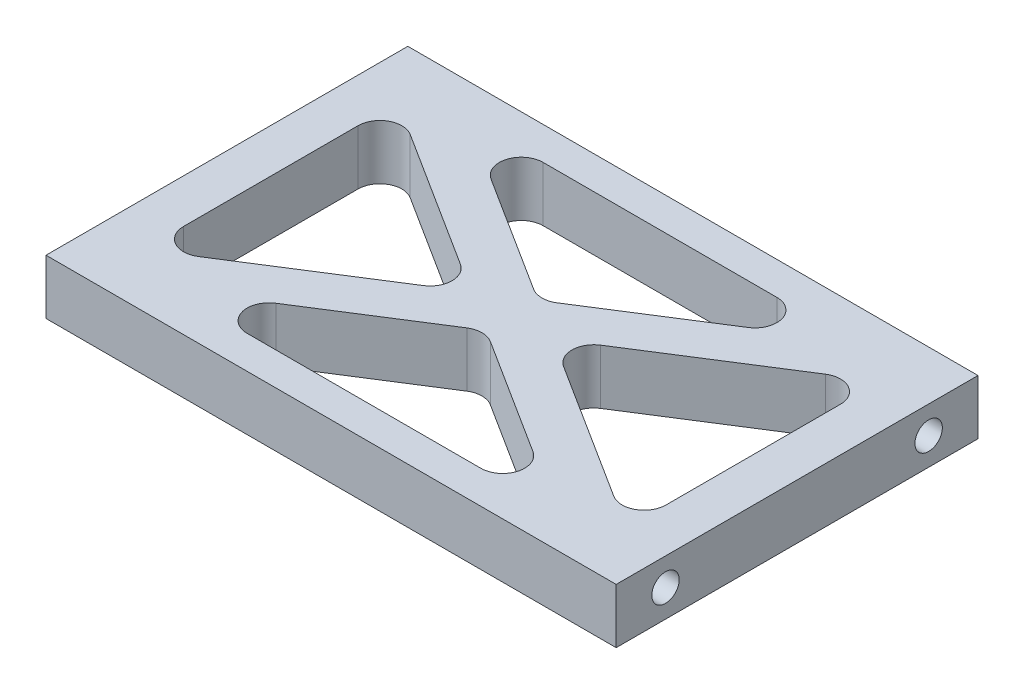
ISO-10303-21;
HEADER;
FILE_DESCRIPTION(('STEP AP214'),'2;1');
FILE_NAME('part.step','',(''),(''),'','','');
FILE_SCHEMA(('AUTOMOTIVE_DESIGN { 1 0 10303 214 1 1 1 1 }'));
ENDSEC;
DATA;
#1=APPLICATION_CONTEXT('core data for automotive mechanical design processes');
#2=APPLICATION_PROTOCOL_DEFINITION('international standard','automotive_design',2000,#1);
#3=PRODUCT_CONTEXT('',#1,'mechanical');
#4=PRODUCT('Part','Part','',(#3));
#5=PRODUCT_RELATED_PRODUCT_CATEGORY('part','',(#4));
#6=PRODUCT_DEFINITION_FORMATION('','',#4);
#7=PRODUCT_DEFINITION_CONTEXT('part definition',#1,'design');
#8=PRODUCT_DEFINITION('design','',#6,#7);
#9=PRODUCT_DEFINITION_SHAPE('','',#8);
#10=(LENGTH_UNIT() NAMED_UNIT(*) SI_UNIT(.MILLI.,.METRE.));
#11=(NAMED_UNIT(*) PLANE_ANGLE_UNIT() SI_UNIT($,.RADIAN.));
#12=(NAMED_UNIT(*) SI_UNIT($,.STERADIAN.) SOLID_ANGLE_UNIT());
#13=UNCERTAINTY_MEASURE_WITH_UNIT(LENGTH_MEASURE(1.E-05),#10,'distance_accuracy_value','');
#14=(GEOMETRIC_REPRESENTATION_CONTEXT(3) GLOBAL_UNCERTAINTY_ASSIGNED_CONTEXT((#13)) GLOBAL_UNIT_ASSIGNED_CONTEXT((#10,
#11,#12)) REPRESENTATION_CONTEXT('',''));
#15=CARTESIAN_POINT('',(0.,0.,0.));
#16=DIRECTION('',(0.,0.,1.));
#17=DIRECTION('',(1.,0.,0.));
#18=AXIS2_PLACEMENT_3D('',#15,#16,#17);
#19=CARTESIAN_POINT('',(0.,5.,0.));
#20=DIRECTION('',(0.,-1.,0.));
#21=DIRECTION('',(0.,0.,-1.));
#22=AXIS2_PLACEMENT_3D('',#19,#20,#21);
#23=PLANE('',#22);
#24=DIRECTION('',(0.,0.,-1.));
#25=VECTOR('',#24,1.);
#26=CARTESIAN_POINT('',(48.,5.,-28.0927947553596));
#27=LINE('',#26,#25);
#28=CARTESIAN_POINT('',(48.,5.,-8.54517972005013));
#29=VERTEX_POINT('',#28);
#30=CARTESIAN_POINT('',(48.,5.,-24.4548202799499));
#31=VERTEX_POINT('',#30);
#32=EDGE_CURVE('E565',#29,#31,#27,.T.);
#33=ORIENTED_EDGE('',*,*,#32,.F.);
#34=CARTESIAN_POINT('',(46.,5.,-8.54517972005013));
#35=DIRECTION('',(0.,-1.,0.));
#36=DIRECTION('',(0.,0.,-1.));
#37=AXIS2_PLACEMENT_3D('',#34,#35,#36);
#38=CIRCLE('',#37,2.);
#39=CARTESIAN_POINT('',(44.928351120537,5.,-6.85652087968426));
#40=VERTEX_POINT('',#39);
#41=EDGE_CURVE('E309',#29,#40,#38,.T.);
#42=ORIENTED_EDGE('',*,*,#41,.T.);
#43=DIRECTION('',(0.844329420182934,0.,0.535824439731477));
#44=VECTOR('',#43,1.);
#45=CARTESIAN_POINT('',(48.,5.,-4.90720524464046));
#46=LINE('',#45,#44);
#47=CARTESIAN_POINT('',(32.393482800616,5.,-14.8113411596341));
#48=VERTEX_POINT('',#47);
#49=EDGE_CURVE('E383',#48,#40,#46,.T.);
#50=ORIENTED_EDGE('',*,*,#49,.F.);
#51=CARTESIAN_POINT('',(33.4651316800789,5.,-16.5));
#52=DIRECTION('',(0.,-1.,0.));
#53=DIRECTION('',(0.,0.,-1.));
#54=AXIS2_PLACEMENT_3D('',#51,#52,#53);
#55=CIRCLE('',#54,2.);
#56=CARTESIAN_POINT('',(32.393482800616,5.,-18.1886588403659));
#57=VERTEX_POINT('',#56);
#58=EDGE_CURVE('E333',#48,#57,#55,.T.);
#59=ORIENTED_EDGE('',*,*,#58,.T.);
#60=DIRECTION('',(-0.844329420182933,0.,0.535824439731478));
#61=VECTOR('',#60,1.);
#62=CARTESIAN_POINT('',(29.7325658400395,5.,-16.5));
#63=LINE('',#62,#61);
#64=CARTESIAN_POINT('',(44.928351120537,5.,-26.1434791203158));
#65=VERTEX_POINT('',#64);
#66=EDGE_CURVE('E568',#65,#57,#63,.T.);
#67=ORIENTED_EDGE('',*,*,#66,.F.);
#68=CARTESIAN_POINT('',(46.,5.,-24.4548202799499));
#69=DIRECTION('',(0.,-1.,0.));
#70=DIRECTION('',(0.,0.,-1.));
#71=AXIS2_PLACEMENT_3D('',#68,#69,#70);
#72=CIRCLE('',#71,2.);
#73=EDGE_CURVE('E313',#65,#31,#72,.T.);
#74=ORIENTED_EDGE('',*,*,#73,.T.);
#75=EDGE_LOOP('',(#33,#42,#50,#59,#67,#74));
#76=FACE_BOUND('',#75,.T.);
#77=DIRECTION('',(-0.844329420182933,0.,-0.535824439731477));
#78=VECTOR('',#77,1.);
#79=CARTESIAN_POINT('',(22.2674341599605,5.,-16.5));
#80=LINE('',#79,#78);
#81=CARTESIAN_POINT('',(19.606517199384,5.,-18.1886588403659));
#82=VERTEX_POINT('',#81);
#83=CARTESIAN_POINT('',(7.07164887946296,5.,-26.1434791203158));
#84=VERTEX_POINT('',#83);
#85=EDGE_CURVE('E385',#82,#84,#80,.T.);
#86=ORIENTED_EDGE('',*,*,#85,.F.);
#87=CARTESIAN_POINT('',(18.534868319921,5.,-16.5));
#88=DIRECTION('',(0.,-1.,0.));
#89=DIRECTION('',(0.,0.,-1.));
#90=AXIS2_PLACEMENT_3D('',#87,#88,#89);
#91=CIRCLE('',#90,2.);
#92=CARTESIAN_POINT('',(19.606517199384,5.,-14.8113411596341));
#93=VERTEX_POINT('',#92);
#94=EDGE_CURVE('E337',#82,#93,#91,.T.);
#95=ORIENTED_EDGE('',*,*,#94,.T.);
#96=DIRECTION('',(0.844329420182933,0.,-0.535824439731477));
#97=VECTOR('',#96,1.);
#98=CARTESIAN_POINT('',(4.,5.,-4.90720524464044));
#99=LINE('',#98,#97);
#100=CARTESIAN_POINT('',(7.07164887946296,5.,-6.85652087968424));
#101=VERTEX_POINT('',#100);
#102=EDGE_CURVE('E392',#101,#93,#99,.T.);
#103=ORIENTED_EDGE('',*,*,#102,.F.);
#104=CARTESIAN_POINT('',(6.,5.,-8.54517972005011));
#105=DIRECTION('',(0.,-1.,0.));
#106=DIRECTION('',(0.,0.,-1.));
#107=AXIS2_PLACEMENT_3D('',#104,#105,#106);
#108=CIRCLE('',#107,2.);
#109=CARTESIAN_POINT('',(4.,5.,-8.54517972005011));
#110=VERTEX_POINT('',#109);
#111=EDGE_CURVE('E329',#101,#110,#108,.T.);
#112=ORIENTED_EDGE('',*,*,#111,.T.);
#113=DIRECTION('',(0.,0.,1.));
#114=VECTOR('',#113,1.);
#115=CARTESIAN_POINT('',(4.,5.,-28.0927947553596));
#116=LINE('',#115,#114);
#117=CARTESIAN_POINT('',(4.,5.,-24.4548202799499));
#118=VERTEX_POINT('',#117);
#119=EDGE_CURVE('E388',#118,#110,#116,.T.);
#120=ORIENTED_EDGE('',*,*,#119,.F.);
#121=CARTESIAN_POINT('',(6.,5.,-24.4548202799499));
#122=DIRECTION('',(0.,-1.,0.));
#123=DIRECTION('',(0.,0.,-1.));
#124=AXIS2_PLACEMENT_3D('',#121,#122,#123);
#125=CIRCLE('',#124,2.);
#126=EDGE_CURVE('E325',#118,#84,#125,.T.);
#127=ORIENTED_EDGE('',*,*,#126,.T.);
#128=EDGE_LOOP('',(#86,#95,#103,#112,#120,#127));
#129=FACE_BOUND('',#128,.T.);
#130=DIRECTION('',(0.,0.,1.));
#131=VECTOR('',#130,1.);
#132=CARTESIAN_POINT('',(0.,5.,0.));
#133=LINE('',#132,#131);
#134=CARTESIAN_POINT('',(0.,5.,-33.));
#135=VERTEX_POINT('',#134);
#136=CARTESIAN_POINT('',(0.,5.,0.));
#137=VERTEX_POINT('',#136);
#138=EDGE_CURVE('E230',#135,#137,#133,.T.);
#139=ORIENTED_EDGE('',*,*,#138,.T.);
#140=DIRECTION('',(1.,0.,0.));
#141=VECTOR('',#140,1.);
#142=CARTESIAN_POINT('',(0.,5.,0.));
#143=LINE('',#142,#141);
#144=CARTESIAN_POINT('',(52.,5.,0.));
#145=VERTEX_POINT('',#144);
#146=EDGE_CURVE('E219',#137,#145,#143,.T.);
#147=ORIENTED_EDGE('',*,*,#146,.T.);
#148=DIRECTION('',(0.,0.,-1.));
#149=VECTOR('',#148,1.);
#150=CARTESIAN_POINT('',(52.,5.,0.));
#151=LINE('',#150,#149);
#152=CARTESIAN_POINT('',(52.,5.,-33.));
#153=VERTEX_POINT('',#152);
#154=EDGE_CURVE('E229',#145,#153,#151,.T.);
#155=ORIENTED_EDGE('',*,*,#154,.T.);
#156=DIRECTION('',(-1.,0.,0.));
#157=VECTOR('',#156,1.);
#158=CARTESIAN_POINT('',(0.,5.,-33.));
#159=LINE('',#158,#157);
#160=EDGE_CURVE('E234',#153,#135,#159,.T.);
#161=ORIENTED_EDGE('',*,*,#160,.T.);
#162=EDGE_LOOP('',(#139,#147,#155,#161));
#163=FACE_BOUND('',#162,.T.);
#164=DIRECTION('',(-0.844329420182933,0.,-0.535824439731477));
#165=VECTOR('',#164,1.);
#166=CARTESIAN_POINT('',(43.5401614326878,5.,-3.));
#167=LINE('',#166,#165);
#168=CARTESIAN_POINT('',(37.7277293205961,5.,-6.68865884036587));
#169=VERTEX_POINT('',#168);
#170=CARTESIAN_POINT('',(27.0716488794629,5.,-13.4511714280081));
#171=VERTEX_POINT('',#170);
#172=EDGE_CURVE('E361',#169,#171,#167,.T.);
#173=ORIENTED_EDGE('',*,*,#172,.F.);
#174=CARTESIAN_POINT('',(36.6560804411331,5.,-5.));
#175=DIRECTION('',(0.,-1.,0.));
#176=DIRECTION('',(0.,0.,-1.));
#177=AXIS2_PLACEMENT_3D('',#174,#175,#176);
#178=CIRCLE('',#177,2.);
#179=CARTESIAN_POINT('',(36.6560804411331,5.,-3.));
#180=VERTEX_POINT('',#179);
#181=EDGE_CURVE('E48',#169,#180,#178,.T.);
#182=ORIENTED_EDGE('',*,*,#181,.T.);
#183=DIRECTION('',(1.,0.,0.));
#184=VECTOR('',#183,1.);
#185=CARTESIAN_POINT('',(8.45983856731221,5.,-3.));
#186=LINE('',#185,#184);
#187=CARTESIAN_POINT('',(15.3439195588668,5.,-3.));
#188=VERTEX_POINT('',#187);
#189=EDGE_CURVE('E369',#188,#180,#186,.T.);
#190=ORIENTED_EDGE('',*,*,#189,.F.);
#191=CARTESIAN_POINT('',(15.3439195588668,5.,-5.));
#192=DIRECTION('',(0.,-1.,0.));
#193=DIRECTION('',(0.,0.,-1.));
#194=AXIS2_PLACEMENT_3D('',#191,#192,#193);
#195=CIRCLE('',#194,2.);
#196=CARTESIAN_POINT('',(14.2722706794039,5.,-6.68865884036587));
#197=VERTEX_POINT('',#196);
#198=EDGE_CURVE('E11',#188,#197,#195,.T.);
#199=ORIENTED_EDGE('',*,*,#198,.T.);
#200=DIRECTION('',(-0.844329420182934,0.,0.535824439731477));
#201=VECTOR('',#200,1.);
#202=CARTESIAN_POINT('',(26.,5.,-14.1312562938211));
#203=LINE('',#202,#201);
#204=CARTESIAN_POINT('',(24.928351120537,5.,-13.4511714280081));
#205=VERTEX_POINT('',#204);
#206=EDGE_CURVE('E367',#205,#197,#203,.T.);
#207=ORIENTED_EDGE('',*,*,#206,.F.);
#208=CARTESIAN_POINT('',(26.,5.,-11.7625125876422));
#209=DIRECTION('',(0.,-1.,0.));
#210=DIRECTION('',(0.,0.,-1.));
#211=AXIS2_PLACEMENT_3D('',#208,#209,#210);
#212=CIRCLE('',#211,2.);
#213=EDGE_CURVE('E345',#205,#171,#212,.T.);
#214=ORIENTED_EDGE('',*,*,#213,.T.);
#215=EDGE_LOOP('',(#173,#182,#190,#199,#207,#214));
#216=FACE_BOUND('',#215,.T.);
#217=DIRECTION('',(0.844329420182934,0.,0.535824439731477));
#218=VECTOR('',#217,1.);
#219=CARTESIAN_POINT('',(26.,5.,-18.8687437061789));
#220=LINE('',#219,#218);
#221=CARTESIAN_POINT('',(14.2722706794039,5.,-26.3113411596341));
#222=VERTEX_POINT('',#221);
#223=CARTESIAN_POINT('',(24.928351120537,5.,-19.5488285719919));
#224=VERTEX_POINT('',#223);
#225=EDGE_CURVE('E547',#222,#224,#220,.T.);
#226=ORIENTED_EDGE('',*,*,#225,.F.);
#227=CARTESIAN_POINT('',(15.3439195588668,5.,-28.));
#228=DIRECTION('',(0.,-1.,0.));
#229=DIRECTION('',(0.,0.,-1.));
#230=AXIS2_PLACEMENT_3D('',#227,#228,#229);
#231=CIRCLE('',#230,2.);
#232=CARTESIAN_POINT('',(15.3439195588668,5.,-30.));
#233=VERTEX_POINT('',#232);
#234=EDGE_CURVE('E321',#222,#233,#231,.T.);
#235=ORIENTED_EDGE('',*,*,#234,.T.);
#236=DIRECTION('',(-1.,0.,0.));
#237=VECTOR('',#236,1.);
#238=CARTESIAN_POINT('',(8.45983856731221,5.,-30.));
#239=LINE('',#238,#237);
#240=CARTESIAN_POINT('',(36.6560804411331,5.,-30.));
#241=VERTEX_POINT('',#240);
#242=EDGE_CURVE('E554',#241,#233,#239,.T.);
#243=ORIENTED_EDGE('',*,*,#242,.F.);
#244=CARTESIAN_POINT('',(36.6560804411331,5.,-28.));
#245=DIRECTION('',(0.,-1.,0.));
#246=DIRECTION('',(0.,0.,-1.));
#247=AXIS2_PLACEMENT_3D('',#244,#245,#246);
#248=CIRCLE('',#247,2.);
#249=CARTESIAN_POINT('',(37.7277293205961,5.,-26.3113411596341));
#250=VERTEX_POINT('',#249);
#251=EDGE_CURVE('E317',#241,#250,#248,.T.);
#252=ORIENTED_EDGE('',*,*,#251,.T.);
#253=DIRECTION('',(0.844329420182934,0.,-0.535824439731477));
#254=VECTOR('',#253,1.);
#255=CARTESIAN_POINT('',(43.5401614326878,5.,-30.));
#256=LINE('',#255,#254);
#257=CARTESIAN_POINT('',(27.0716488794629,5.,-19.5488285719919));
#258=VERTEX_POINT('',#257);
#259=EDGE_CURVE('E550',#258,#250,#256,.T.);
#260=ORIENTED_EDGE('',*,*,#259,.F.);
#261=CARTESIAN_POINT('',(26.,5.,-21.2374874123578));
#262=DIRECTION('',(0.,-1.,0.));
#263=DIRECTION('',(0.,0.,-1.));
#264=AXIS2_PLACEMENT_3D('',#261,#262,#263);
#265=CIRCLE('',#264,2.);
#266=EDGE_CURVE('E341',#258,#224,#265,.T.);
#267=ORIENTED_EDGE('',*,*,#266,.T.);
#268=EDGE_LOOP('',(#226,#235,#243,#252,#260,#267));
#269=FACE_BOUND('',#268,.T.);
#270=ADVANCED_FACE('F33',(#76,#129,#163,#216,#269),#23,.F.);
#271=CARTESIAN_POINT('',(0.,0.,0.));
#272=DIRECTION('',(0.,-1.,0.));
#273=DIRECTION('',(0.,0.,-1.));
#274=AXIS2_PLACEMENT_3D('',#271,#272,#273);
#275=PLANE('',#274);
#276=DIRECTION('',(0.,0.,1.));
#277=VECTOR('',#276,1.);
#278=CARTESIAN_POINT('',(0.,0.,0.));
#279=LINE('',#278,#277);
#280=CARTESIAN_POINT('',(0.,0.,-33.));
#281=VERTEX_POINT('',#280);
#282=CARTESIAN_POINT('',(0.,0.,0.));
#283=VERTEX_POINT('',#282);
#284=EDGE_CURVE('E242',#281,#283,#279,.T.);
#285=ORIENTED_EDGE('',*,*,#284,.F.);
#286=DIRECTION('',(-1.,0.,0.));
#287=VECTOR('',#286,1.);
#288=CARTESIAN_POINT('',(0.,0.,-33.));
#289=LINE('',#288,#287);
#290=CARTESIAN_POINT('',(52.,0.,-33.));
#291=VERTEX_POINT('',#290);
#292=EDGE_CURVE('E238',#291,#281,#289,.T.);
#293=ORIENTED_EDGE('',*,*,#292,.F.);
#294=DIRECTION('',(0.,0.,-1.));
#295=VECTOR('',#294,1.);
#296=CARTESIAN_POINT('',(52.,0.,0.));
#297=LINE('',#296,#295);
#298=CARTESIAN_POINT('',(52.,0.,0.));
#299=VERTEX_POINT('',#298);
#300=EDGE_CURVE('E408',#299,#291,#297,.T.);
#301=ORIENTED_EDGE('',*,*,#300,.F.);
#302=DIRECTION('',(1.,0.,0.));
#303=VECTOR('',#302,1.);
#304=CARTESIAN_POINT('',(0.,0.,0.));
#305=LINE('',#304,#303);
#306=EDGE_CURVE('E406',#283,#299,#305,.T.);
#307=ORIENTED_EDGE('',*,*,#306,.F.);
#308=EDGE_LOOP('',(#285,#293,#301,#307));
#309=FACE_BOUND('',#308,.T.);
#310=DIRECTION('',(0.,0.,1.));
#311=VECTOR('',#310,1.);
#312=CARTESIAN_POINT('',(4.,0.,-28.0927947553596));
#313=LINE('',#312,#311);
#314=CARTESIAN_POINT('',(4.,0.,-24.4548202799499));
#315=VERTEX_POINT('',#314);
#316=CARTESIAN_POINT('',(4.,0.,-8.54517972005011));
#317=VERTEX_POINT('',#316);
#318=EDGE_CURVE('E397',#315,#317,#313,.T.);
#319=ORIENTED_EDGE('',*,*,#318,.T.);
#320=CARTESIAN_POINT('',(6.,0.,-8.54517972005011));
#321=DIRECTION('',(0.,-1.,0.));
#322=DIRECTION('',(0.,0.,-1.));
#323=AXIS2_PLACEMENT_3D('',#320,#321,#322);
#324=CIRCLE('',#323,2.);
#325=CARTESIAN_POINT('',(7.07164887946296,0.,-6.85652087968424));
#326=VERTEX_POINT('',#325);
#327=EDGE_CURVE('E327',#317,#326,#324,.F.);
#328=ORIENTED_EDGE('',*,*,#327,.T.);
#329=DIRECTION('',(0.844329420182933,0.,-0.535824439731477));
#330=VECTOR('',#329,1.);
#331=CARTESIAN_POINT('',(4.,0.,-4.90720524464044));
#332=LINE('',#331,#330);
#333=CARTESIAN_POINT('',(19.606517199384,0.,-14.8113411596341));
#334=VERTEX_POINT('',#333);
#335=EDGE_CURVE('E389',#326,#334,#332,.T.);
#336=ORIENTED_EDGE('',*,*,#335,.T.);
#337=CARTESIAN_POINT('',(18.534868319921,0.,-16.5));
#338=DIRECTION('',(0.,-1.,0.));
#339=DIRECTION('',(0.,0.,-1.));
#340=AXIS2_PLACEMENT_3D('',#337,#338,#339);
#341=CIRCLE('',#340,2.);
#342=CARTESIAN_POINT('',(19.606517199384,0.,-18.1886588403659));
#343=VERTEX_POINT('',#342);
#344=EDGE_CURVE('E335',#334,#343,#341,.F.);
#345=ORIENTED_EDGE('',*,*,#344,.T.);
#346=DIRECTION('',(-0.844329420182933,0.,-0.535824439731477));
#347=VECTOR('',#346,1.);
#348=CARTESIAN_POINT('',(22.2674341599605,0.,-16.5));
#349=LINE('',#348,#347);
#350=CARTESIAN_POINT('',(7.07164887946296,0.,-26.1434791203158));
#351=VERTEX_POINT('',#350);
#352=EDGE_CURVE('E374',#343,#351,#349,.T.);
#353=ORIENTED_EDGE('',*,*,#352,.T.);
#354=CARTESIAN_POINT('',(6.,0.,-24.4548202799499));
#355=DIRECTION('',(0.,-1.,0.));
#356=DIRECTION('',(0.,0.,-1.));
#357=AXIS2_PLACEMENT_3D('',#354,#355,#356);
#358=CIRCLE('',#357,2.);
#359=EDGE_CURVE('E323',#351,#315,#358,.F.);
#360=ORIENTED_EDGE('',*,*,#359,.T.);
#361=EDGE_LOOP('',(#319,#328,#336,#345,#353,#360));
#362=FACE_BOUND('',#361,.T.);
#363=DIRECTION('',(-0.844329420182934,0.,0.535824439731477));
#364=VECTOR('',#363,1.);
#365=CARTESIAN_POINT('',(26.,0.,-14.1312562938211));
#366=LINE('',#365,#364);
#367=CARTESIAN_POINT('',(24.928351120537,0.,-13.4511714280081));
#368=VERTEX_POINT('',#367);
#369=CARTESIAN_POINT('',(14.2722706794039,0.,-6.68865884036587));
#370=VERTEX_POINT('',#369);
#371=EDGE_CURVE('E356',#368,#370,#366,.T.);
#372=ORIENTED_EDGE('',*,*,#371,.T.);
#373=CARTESIAN_POINT('',(15.3439195588668,0.,-5.));
#374=DIRECTION('',(0.,-1.,0.));
#375=DIRECTION('',(0.,0.,-1.));
#376=AXIS2_PLACEMENT_3D('',#373,#374,#375);
#377=CIRCLE('',#376,2.);
#378=CARTESIAN_POINT('',(15.3439195588668,0.,-3.));
#379=VERTEX_POINT('',#378);
#380=EDGE_CURVE('E41',#370,#379,#377,.F.);
#381=ORIENTED_EDGE('',*,*,#380,.T.);
#382=DIRECTION('',(1.,0.,0.));
#383=VECTOR('',#382,1.);
#384=CARTESIAN_POINT('',(8.45983856731221,0.,-3.));
#385=LINE('',#384,#383);
#386=CARTESIAN_POINT('',(36.6560804411331,0.,-3.));
#387=VERTEX_POINT('',#386);
#388=EDGE_CURVE('E354',#379,#387,#385,.T.);
#389=ORIENTED_EDGE('',*,*,#388,.T.);
#390=CARTESIAN_POINT('',(36.6560804411331,0.,-5.));
#391=DIRECTION('',(0.,-1.,0.));
#392=DIRECTION('',(0.,0.,-1.));
#393=AXIS2_PLACEMENT_3D('',#390,#391,#392);
#394=CIRCLE('',#393,2.);
#395=CARTESIAN_POINT('',(37.7277293205961,0.,-6.68865884036587));
#396=VERTEX_POINT('',#395);
#397=EDGE_CURVE('E347',#387,#396,#394,.F.);
#398=ORIENTED_EDGE('',*,*,#397,.T.);
#399=DIRECTION('',(-0.844329420182933,0.,-0.535824439731477));
#400=VECTOR('',#399,1.);
#401=CARTESIAN_POINT('',(43.5401614326878,0.,-3.));
#402=LINE('',#401,#400);
#403=CARTESIAN_POINT('',(27.0716488794629,0.,-13.4511714280081));
#404=VERTEX_POINT('',#403);
#405=EDGE_CURVE('E380',#396,#404,#402,.T.);
#406=ORIENTED_EDGE('',*,*,#405,.T.);
#407=CARTESIAN_POINT('',(26.,0.,-11.7625125876422));
#408=DIRECTION('',(0.,-1.,0.));
#409=DIRECTION('',(0.,0.,-1.));
#410=AXIS2_PLACEMENT_3D('',#407,#408,#409);
#411=CIRCLE('',#410,2.);
#412=EDGE_CURVE('E343',#404,#368,#411,.F.);
#413=ORIENTED_EDGE('',*,*,#412,.T.);
#414=EDGE_LOOP('',(#372,#381,#389,#398,#406,#413));
#415=FACE_BOUND('',#414,.T.);
#416=DIRECTION('',(-0.844329420182933,0.,0.535824439731478));
#417=VECTOR('',#416,1.);
#418=CARTESIAN_POINT('',(29.7325658400395,0.,-16.5));
#419=LINE('',#418,#417);
#420=CARTESIAN_POINT('',(44.928351120537,0.,-26.1434791203158));
#421=VERTEX_POINT('',#420);
#422=CARTESIAN_POINT('',(32.393482800616,0.,-18.1886588403659));
#423=VERTEX_POINT('',#422);
#424=EDGE_CURVE('E576',#421,#423,#419,.T.);
#425=ORIENTED_EDGE('',*,*,#424,.T.);
#426=CARTESIAN_POINT('',(33.4651316800789,0.,-16.5));
#427=DIRECTION('',(0.,-1.,0.));
#428=DIRECTION('',(0.,0.,-1.));
#429=AXIS2_PLACEMENT_3D('',#426,#427,#428);
#430=CIRCLE('',#429,2.);
#431=CARTESIAN_POINT('',(32.393482800616,0.,-14.8113411596341));
#432=VERTEX_POINT('',#431);
#433=EDGE_CURVE('E331',#423,#432,#430,.F.);
#434=ORIENTED_EDGE('',*,*,#433,.T.);
#435=DIRECTION('',(0.844329420182934,0.,0.535824439731477));
#436=VECTOR('',#435,1.);
#437=CARTESIAN_POINT('',(48.,0.,-4.90720524464046));
#438=LINE('',#437,#436);
#439=CARTESIAN_POINT('',(44.928351120537,0.,-6.85652087968426));
#440=VERTEX_POINT('',#439);
#441=EDGE_CURVE('E569',#432,#440,#438,.T.);
#442=ORIENTED_EDGE('',*,*,#441,.T.);
#443=CARTESIAN_POINT('',(46.,0.,-8.54517972005013));
#444=DIRECTION('',(0.,-1.,0.));
#445=DIRECTION('',(0.,0.,-1.));
#446=AXIS2_PLACEMENT_3D('',#443,#444,#445);
#447=CIRCLE('',#446,2.);
#448=CARTESIAN_POINT('',(48.,0.,-8.54517972005013));
#449=VERTEX_POINT('',#448);
#450=EDGE_CURVE('E307',#440,#449,#447,.F.);
#451=ORIENTED_EDGE('',*,*,#450,.T.);
#452=DIRECTION('',(0.,0.,-1.));
#453=VECTOR('',#452,1.);
#454=CARTESIAN_POINT('',(48.,0.,-28.0927947553596));
#455=LINE('',#454,#453);
#456=CARTESIAN_POINT('',(48.,0.,-24.4548202799499));
#457=VERTEX_POINT('',#456);
#458=EDGE_CURVE('E557',#449,#457,#455,.T.);
#459=ORIENTED_EDGE('',*,*,#458,.T.);
#460=CARTESIAN_POINT('',(46.,0.,-24.4548202799499));
#461=DIRECTION('',(0.,-1.,0.));
#462=DIRECTION('',(0.,0.,-1.));
#463=AXIS2_PLACEMENT_3D('',#460,#461,#462);
#464=CIRCLE('',#463,2.);
#465=EDGE_CURVE('E311',#457,#421,#464,.F.);
#466=ORIENTED_EDGE('',*,*,#465,.T.);
#467=EDGE_LOOP('',(#425,#434,#442,#451,#459,#466));
#468=FACE_BOUND('',#467,.T.);
#469=DIRECTION('',(0.844329420182934,0.,-0.535824439731477));
#470=VECTOR('',#469,1.);
#471=CARTESIAN_POINT('',(43.5401614326878,0.,-30.));
#472=LINE('',#471,#470);
#473=CARTESIAN_POINT('',(27.0716488794629,0.,-19.5488285719919));
#474=VERTEX_POINT('',#473);
#475=CARTESIAN_POINT('',(37.7277293205961,0.,-26.3113411596341));
#476=VERTEX_POINT('',#475);
#477=EDGE_CURVE('E560',#474,#476,#472,.T.);
#478=ORIENTED_EDGE('',*,*,#477,.T.);
#479=CARTESIAN_POINT('',(36.6560804411331,0.,-28.));
#480=DIRECTION('',(0.,-1.,0.));
#481=DIRECTION('',(0.,0.,-1.));
#482=AXIS2_PLACEMENT_3D('',#479,#480,#481);
#483=CIRCLE('',#482,2.);
#484=CARTESIAN_POINT('',(36.6560804411331,0.,-30.));
#485=VERTEX_POINT('',#484);
#486=EDGE_CURVE('E315',#476,#485,#483,.F.);
#487=ORIENTED_EDGE('',*,*,#486,.T.);
#488=DIRECTION('',(-1.,0.,0.));
#489=VECTOR('',#488,1.);
#490=CARTESIAN_POINT('',(8.45983856731221,0.,-30.));
#491=LINE('',#490,#489);
#492=CARTESIAN_POINT('',(15.3439195588668,0.,-30.));
#493=VERTEX_POINT('',#492);
#494=EDGE_CURVE('E551',#485,#493,#491,.T.);
#495=ORIENTED_EDGE('',*,*,#494,.T.);
#496=CARTESIAN_POINT('',(15.3439195588668,0.,-28.));
#497=DIRECTION('',(0.,-1.,0.));
#498=DIRECTION('',(0.,0.,-1.));
#499=AXIS2_PLACEMENT_3D('',#496,#497,#498);
#500=CIRCLE('',#499,2.);
#501=CARTESIAN_POINT('',(14.2722706794039,0.,-26.3113411596341));
#502=VERTEX_POINT('',#501);
#503=EDGE_CURVE('E319',#493,#502,#500,.F.);
#504=ORIENTED_EDGE('',*,*,#503,.T.);
#505=DIRECTION('',(0.844329420182934,0.,0.535824439731477));
#506=VECTOR('',#505,1.);
#507=CARTESIAN_POINT('',(26.,0.,-18.8687437061789));
#508=LINE('',#507,#506);
#509=CARTESIAN_POINT('',(24.928351120537,0.,-19.5488285719919));
#510=VERTEX_POINT('',#509);
#511=EDGE_CURVE('E541',#502,#510,#508,.T.);
#512=ORIENTED_EDGE('',*,*,#511,.T.);
#513=CARTESIAN_POINT('',(26.,0.,-21.2374874123578));
#514=DIRECTION('',(0.,-1.,0.));
#515=DIRECTION('',(0.,0.,-1.));
#516=AXIS2_PLACEMENT_3D('',#513,#514,#515);
#517=CIRCLE('',#516,2.);
#518=EDGE_CURVE('E339',#510,#474,#517,.F.);
#519=ORIENTED_EDGE('',*,*,#518,.T.);
#520=EDGE_LOOP('',(#478,#487,#495,#504,#512,#519));
#521=FACE_BOUND('',#520,.T.);
#522=ADVANCED_FACE('F352',(#309,#362,#415,#468,#521),#275,.T.);
#523=CARTESIAN_POINT('',(0.,5.,0.));
#524=DIRECTION('',(1.,0.,0.));
#525=DIRECTION('',(0.,0.,-1.));
#526=AXIS2_PLACEMENT_3D('',#523,#524,#525);
#527=PLANE('',#526);
#528=CARTESIAN_POINT('',(0.,2.5,-4.49999999999998));
#529=DIRECTION('',(1.,0.,0.));
#530=DIRECTION('',(0.,0.,-1.));
#531=AXIS2_PLACEMENT_3D('',#528,#529,#530);
#532=CIRCLE('',#531,1.25);
#533=CARTESIAN_POINT('',(0.,2.5,-5.74999999999998));
#534=VERTEX_POINT('',#533);
#535=EDGE_CURVE('E524',#534,#534,#532,.T.);
#536=ORIENTED_EDGE('',*,*,#535,.T.);
#537=EDGE_LOOP('',(#536));
#538=FACE_BOUND('',#537,.T.);
#539=CARTESIAN_POINT('',(0.,2.5,-28.5));
#540=DIRECTION('',(1.,0.,0.));
#541=DIRECTION('',(0.,0.,1.));
#542=AXIS2_PLACEMENT_3D('',#539,#540,#541);
#543=CIRCLE('',#542,1.25);
#544=CARTESIAN_POINT('',(0.,2.5,-27.25));
#545=VERTEX_POINT('',#544);
#546=EDGE_CURVE('E535',#545,#545,#543,.T.);
#547=ORIENTED_EDGE('',*,*,#546,.T.);
#548=EDGE_LOOP('',(#547));
#549=FACE_BOUND('',#548,.T.);
#550=ORIENTED_EDGE('',*,*,#284,.T.);
#551=DIRECTION('',(0.,-1.,0.));
#552=VECTOR('',#551,1.);
#553=CARTESIAN_POINT('',(0.,5.,0.));
#554=LINE('',#553,#552);
#555=EDGE_CURVE('E223',#137,#283,#554,.T.);
#556=ORIENTED_EDGE('',*,*,#555,.F.);
#557=ORIENTED_EDGE('',*,*,#138,.F.);
#558=DIRECTION('',(0.,-1.,0.));
#559=VECTOR('',#558,1.);
#560=CARTESIAN_POINT('',(0.,5.,-33.));
#561=LINE('',#560,#559);
#562=EDGE_CURVE('E404',#135,#281,#561,.T.);
#563=ORIENTED_EDGE('',*,*,#562,.T.);
#564=EDGE_LOOP('',(#550,#556,#557,#563));
#565=FACE_BOUND('',#564,.T.);
#566=ADVANCED_FACE('F240',(#538,#549,#565),#527,.F.);
#567=CARTESIAN_POINT('',(0.,5.,0.));
#568=DIRECTION('',(0.,0.,-1.));
#569=DIRECTION('',(-1.,0.,0.));
#570=AXIS2_PLACEMENT_3D('',#567,#568,#569);
#571=PLANE('',#570);
#572=ORIENTED_EDGE('',*,*,#306,.T.);
#573=DIRECTION('',(0.,-1.,0.));
#574=VECTOR('',#573,1.);
#575=CARTESIAN_POINT('',(52.,5.,0.));
#576=LINE('',#575,#574);
#577=EDGE_CURVE('E226',#145,#299,#576,.T.);
#578=ORIENTED_EDGE('',*,*,#577,.F.);
#579=ORIENTED_EDGE('',*,*,#146,.F.);
#580=ORIENTED_EDGE('',*,*,#555,.T.);
#581=EDGE_LOOP('',(#572,#578,#579,#580));
#582=FACE_BOUND('',#581,.T.);
#583=ADVANCED_FACE('F221',(#582),#571,.F.);
#584=CARTESIAN_POINT('',(52.,5.,0.));
#585=DIRECTION('',(-1.,0.,0.));
#586=DIRECTION('',(0.,0.,1.));
#587=AXIS2_PLACEMENT_3D('',#584,#585,#586);
#588=PLANE('',#587);
#589=CARTESIAN_POINT('',(52.,2.5,-4.5));
#590=DIRECTION('',(1.,0.,0.));
#591=DIRECTION('',(0.,0.,-1.));
#592=AXIS2_PLACEMENT_3D('',#589,#590,#591);
#593=CIRCLE('',#592,1.25);
#594=CARTESIAN_POINT('',(52.,2.5,-5.75));
#595=VERTEX_POINT('',#594);
#596=EDGE_CURVE('E542',#595,#595,#593,.T.);
#597=ORIENTED_EDGE('',*,*,#596,.F.);
#598=EDGE_LOOP('',(#597));
#599=FACE_BOUND('',#598,.T.);
#600=CARTESIAN_POINT('',(52.,2.5,-28.5));
#601=DIRECTION('',(1.,0.,0.));
#602=DIRECTION('',(0.,0.,1.));
#603=AXIS2_PLACEMENT_3D('',#600,#601,#602);
#604=CIRCLE('',#603,1.25);
#605=CARTESIAN_POINT('',(52.,2.5,-27.25));
#606=VERTEX_POINT('',#605);
#607=EDGE_CURVE('E523',#606,#606,#604,.T.);
#608=ORIENTED_EDGE('',*,*,#607,.F.);
#609=EDGE_LOOP('',(#608));
#610=FACE_BOUND('',#609,.T.);
#611=ORIENTED_EDGE('',*,*,#300,.T.);
#612=DIRECTION('',(0.,-1.,0.));
#613=VECTOR('',#612,1.);
#614=CARTESIAN_POINT('',(52.,5.,-33.));
#615=LINE('',#614,#613);
#616=EDGE_CURVE('E247',#153,#291,#615,.T.);
#617=ORIENTED_EDGE('',*,*,#616,.F.);
#618=ORIENTED_EDGE('',*,*,#154,.F.);
#619=ORIENTED_EDGE('',*,*,#577,.T.);
#620=EDGE_LOOP('',(#611,#617,#618,#619));
#621=FACE_BOUND('',#620,.T.);
#622=ADVANCED_FACE('F420',(#599,#610,#621),#588,.F.);
#623=CARTESIAN_POINT('',(0.,5.,-33.));
#624=DIRECTION('',(0.,0.,1.));
#625=DIRECTION('',(1.,0.,0.));
#626=AXIS2_PLACEMENT_3D('',#623,#624,#625);
#627=PLANE('',#626);
#628=ORIENTED_EDGE('',*,*,#292,.T.);
#629=ORIENTED_EDGE('',*,*,#562,.F.);
#630=ORIENTED_EDGE('',*,*,#160,.F.);
#631=ORIENTED_EDGE('',*,*,#616,.T.);
#632=EDGE_LOOP('',(#628,#629,#630,#631));
#633=FACE_BOUND('',#632,.T.);
#634=ADVANCED_FACE('F415',(#633),#627,.F.);
#635=CARTESIAN_POINT('',(22.2674341599605,5.,-16.5));
#636=DIRECTION('',(-0.535824439731477,0.,0.844329420182933));
#637=DIRECTION('',(0.844329420182934,0.,0.535824439731477));
#638=AXIS2_PLACEMENT_3D('',#635,#636,#637);
#639=PLANE('',#638);
#640=ORIENTED_EDGE('',*,*,#85,.T.);
#641=DIRECTION('',(0.,-1.,0.));
#642=VECTOR('',#641,1.);
#643=CARTESIAN_POINT('',(7.07164887946295,0.,-26.1434791203158));
#644=LINE('',#643,#642);
#645=EDGE_CURVE('E280',#84,#351,#644,.T.);
#646=ORIENTED_EDGE('',*,*,#645,.T.);
#647=ORIENTED_EDGE('',*,*,#352,.F.);
#648=DIRECTION('',(0.,-1.,0.));
#649=VECTOR('',#648,1.);
#650=CARTESIAN_POINT('',(19.606517199384,5.,-18.1886588403659));
#651=LINE('',#650,#649);
#652=EDGE_CURVE('E278',#343,#82,#651,.F.);
#653=ORIENTED_EDGE('',*,*,#652,.T.);
#654=EDGE_LOOP('',(#640,#646,#647,#653));
#655=FACE_BOUND('',#654,.T.);
#656=ADVANCED_FACE('F428',(#655),#639,.T.);
#657=CARTESIAN_POINT('',(4.,5.,-28.0927947553596));
#658=DIRECTION('',(1.,0.,0.));
#659=DIRECTION('',(0.,0.,-1.));
#660=AXIS2_PLACEMENT_3D('',#657,#658,#659);
#661=PLANE('',#660);
#662=ORIENTED_EDGE('',*,*,#318,.F.);
#663=DIRECTION('',(0.,-1.,0.));
#664=VECTOR('',#663,1.);
#665=CARTESIAN_POINT('',(4.,5.,-24.4548202799499));
#666=LINE('',#665,#664);
#667=EDGE_CURVE('E286',#315,#118,#666,.F.);
#668=ORIENTED_EDGE('',*,*,#667,.T.);
#669=ORIENTED_EDGE('',*,*,#119,.T.);
#670=DIRECTION('',(0.,-1.,0.));
#671=VECTOR('',#670,1.);
#672=CARTESIAN_POINT('',(4.,0.,-8.54517972005011));
#673=LINE('',#672,#671);
#674=EDGE_CURVE('E283',#110,#317,#673,.T.);
#675=ORIENTED_EDGE('',*,*,#674,.T.);
#676=EDGE_LOOP('',(#662,#668,#669,#675));
#677=FACE_BOUND('',#676,.T.);
#678=ADVANCED_FACE('F445',(#677),#661,.T.);
#679=CARTESIAN_POINT('',(4.,5.,-4.90720524464044));
#680=DIRECTION('',(-0.535824439731477,0.,-0.844329420182933));
#681=DIRECTION('',(-0.844329420182933,0.,0.535824439731477));
#682=AXIS2_PLACEMENT_3D('',#679,#680,#681);
#683=PLANE('',#682);
#684=ORIENTED_EDGE('',*,*,#335,.F.);
#685=DIRECTION('',(0.,-1.,0.));
#686=VECTOR('',#685,1.);
#687=CARTESIAN_POINT('',(7.07164887946296,5.,-6.85652087968424));
#688=LINE('',#687,#686);
#689=EDGE_CURVE('E291',#326,#101,#688,.F.);
#690=ORIENTED_EDGE('',*,*,#689,.T.);
#691=ORIENTED_EDGE('',*,*,#102,.T.);
#692=DIRECTION('',(0.,-1.,0.));
#693=VECTOR('',#692,1.);
#694=CARTESIAN_POINT('',(19.606517199384,0.,-14.8113411596341));
#695=LINE('',#694,#693);
#696=EDGE_CURVE('E288',#93,#334,#695,.T.);
#697=ORIENTED_EDGE('',*,*,#696,.T.);
#698=EDGE_LOOP('',(#684,#690,#691,#697));
#699=FACE_BOUND('',#698,.T.);
#700=ADVANCED_FACE('F449',(#699),#683,.T.);
#701=CARTESIAN_POINT('',(43.5401614326878,5.,-3.));
#702=DIRECTION('',(-0.535824439731477,0.,0.844329420182933));
#703=DIRECTION('',(0.844329420182934,0.,0.535824439731477));
#704=AXIS2_PLACEMENT_3D('',#701,#702,#703);
#705=PLANE('',#704);
#706=ORIENTED_EDGE('',*,*,#172,.T.);
#707=DIRECTION('',(0.,-1.,0.));
#708=VECTOR('',#707,1.);
#709=CARTESIAN_POINT('',(27.0716488794629,0.,-13.4511714280081));
#710=LINE('',#709,#708);
#711=EDGE_CURVE('E295',#171,#404,#710,.T.);
#712=ORIENTED_EDGE('',*,*,#711,.T.);
#713=ORIENTED_EDGE('',*,*,#405,.F.);
#714=DIRECTION('',(0.,-1.,0.));
#715=VECTOR('',#714,1.);
#716=CARTESIAN_POINT('',(37.7277293205961,5.,-6.68865884036587));
#717=LINE('',#716,#715);
#718=EDGE_CURVE('E293',#396,#169,#717,.F.);
#719=ORIENTED_EDGE('',*,*,#718,.T.);
#720=EDGE_LOOP('',(#706,#712,#713,#719));
#721=FACE_BOUND('',#720,.T.);
#722=ADVANCED_FACE('F453',(#721),#705,.T.);
#723=CARTESIAN_POINT('',(26.,5.,-14.1312562938211));
#724=DIRECTION('',(0.535824439731477,0.,0.844329420182933));
#725=DIRECTION('',(0.844329420182933,0.,-0.535824439731477));
#726=AXIS2_PLACEMENT_3D('',#723,#724,#725);
#727=PLANE('',#726);
#728=ORIENTED_EDGE('',*,*,#371,.F.);
#729=DIRECTION('',(0.,-1.,0.));
#730=VECTOR('',#729,1.);
#731=CARTESIAN_POINT('',(24.928351120537,5.,-13.4511714280081));
#732=LINE('',#731,#730);
#733=EDGE_CURVE('E301',#368,#205,#732,.F.);
#734=ORIENTED_EDGE('',*,*,#733,.T.);
#735=ORIENTED_EDGE('',*,*,#206,.T.);
#736=DIRECTION('',(0.,-1.,0.));
#737=VECTOR('',#736,1.);
#738=CARTESIAN_POINT('',(14.2722706794039,0.,-6.68865884036587));
#739=LINE('',#738,#737);
#740=EDGE_CURVE('E298',#197,#370,#739,.T.);
#741=ORIENTED_EDGE('',*,*,#740,.T.);
#742=EDGE_LOOP('',(#728,#734,#735,#741));
#743=FACE_BOUND('',#742,.T.);
#744=ADVANCED_FACE('F371',(#743),#727,.T.);
#745=CARTESIAN_POINT('',(8.45983856731221,5.,-3.));
#746=DIRECTION('',(0.,0.,-1.));
#747=DIRECTION('',(-1.,0.,0.));
#748=AXIS2_PLACEMENT_3D('',#745,#746,#747);
#749=PLANE('',#748);
#750=ORIENTED_EDGE('',*,*,#189,.T.);
#751=DIRECTION('',(0.,-1.,0.));
#752=VECTOR('',#751,1.);
#753=CARTESIAN_POINT('',(36.6560804411331,0.,-3.));
#754=LINE('',#753,#752);
#755=EDGE_CURVE('E304',#180,#387,#754,.T.);
#756=ORIENTED_EDGE('',*,*,#755,.T.);
#757=ORIENTED_EDGE('',*,*,#388,.F.);
#758=DIRECTION('',(0.,-1.,0.));
#759=VECTOR('',#758,1.);
#760=CARTESIAN_POINT('',(15.3439195588668,5.,-3.));
#761=LINE('',#760,#759);
#762=EDGE_CURVE('E55',#379,#188,#761,.F.);
#763=ORIENTED_EDGE('',*,*,#762,.T.);
#764=EDGE_LOOP('',(#750,#756,#757,#763));
#765=FACE_BOUND('',#764,.T.);
#766=ADVANCED_FACE('F359',(#765),#749,.T.);
#767=CARTESIAN_POINT('',(48.,5.,-28.0927947553596));
#768=DIRECTION('',(-1.,0.,0.));
#769=DIRECTION('',(0.,0.,1.));
#770=AXIS2_PLACEMENT_3D('',#767,#768,#769);
#771=PLANE('',#770);
#772=ORIENTED_EDGE('',*,*,#458,.F.);
#773=DIRECTION('',(0.,-1.,0.));
#774=VECTOR('',#773,1.);
#775=CARTESIAN_POINT('',(48.,5.,-8.54517972005013));
#776=LINE('',#775,#774);
#777=EDGE_CURVE('E256',#449,#29,#776,.F.);
#778=ORIENTED_EDGE('',*,*,#777,.T.);
#779=ORIENTED_EDGE('',*,*,#32,.T.);
#780=DIRECTION('',(0.,-1.,0.));
#781=VECTOR('',#780,1.);
#782=CARTESIAN_POINT('',(48.,0.,-24.4548202799499));
#783=LINE('',#782,#781);
#784=EDGE_CURVE('E253',#31,#457,#783,.T.);
#785=ORIENTED_EDGE('',*,*,#784,.T.);
#786=EDGE_LOOP('',(#772,#778,#779,#785));
#787=FACE_BOUND('',#786,.T.);
#788=ADVANCED_FACE('F462',(#787),#771,.T.);
#789=CARTESIAN_POINT('',(29.7325658400395,5.,-16.5));
#790=DIRECTION('',(0.535824439731478,0.,0.844329420182933));
#791=DIRECTION('',(0.844329420182933,0.,-0.535824439731478));
#792=AXIS2_PLACEMENT_3D('',#789,#790,#791);
#793=PLANE('',#792);
#794=ORIENTED_EDGE('',*,*,#424,.F.);
#795=DIRECTION('',(0.,-1.,0.));
#796=VECTOR('',#795,1.);
#797=CARTESIAN_POINT('',(44.928351120537,5.,-26.1434791203158));
#798=LINE('',#797,#796);
#799=EDGE_CURVE('E261',#421,#65,#798,.F.);
#800=ORIENTED_EDGE('',*,*,#799,.T.);
#801=ORIENTED_EDGE('',*,*,#66,.T.);
#802=DIRECTION('',(0.,-1.,0.));
#803=VECTOR('',#802,1.);
#804=CARTESIAN_POINT('',(32.393482800616,0.,-18.1886588403659));
#805=LINE('',#804,#803);
#806=EDGE_CURVE('E258',#57,#423,#805,.T.);
#807=ORIENTED_EDGE('',*,*,#806,.T.);
#808=EDGE_LOOP('',(#794,#800,#801,#807));
#809=FACE_BOUND('',#808,.T.);
#810=ADVANCED_FACE('F465',(#809),#793,.T.);
#811=CARTESIAN_POINT('',(48.,5.,-4.90720524464046));
#812=DIRECTION('',(0.535824439731477,0.,-0.844329420182934));
#813=DIRECTION('',(-0.844329420182934,0.,-0.535824439731477));
#814=AXIS2_PLACEMENT_3D('',#811,#812,#813);
#815=PLANE('',#814);
#816=ORIENTED_EDGE('',*,*,#49,.T.);
#817=DIRECTION('',(0.,-1.,0.));
#818=VECTOR('',#817,1.);
#819=CARTESIAN_POINT('',(44.928351120537,0.,-6.85652087968426));
#820=LINE('',#819,#818);
#821=EDGE_CURVE('E245',#40,#440,#820,.T.);
#822=ORIENTED_EDGE('',*,*,#821,.T.);
#823=ORIENTED_EDGE('',*,*,#441,.F.);
#824=DIRECTION('',(0.,-1.,0.));
#825=VECTOR('',#824,1.);
#826=CARTESIAN_POINT('',(32.393482800616,5.,-14.8113411596341));
#827=LINE('',#826,#825);
#828=EDGE_CURVE('E243',#432,#48,#827,.F.);
#829=ORIENTED_EDGE('',*,*,#828,.T.);
#830=EDGE_LOOP('',(#816,#822,#823,#829));
#831=FACE_BOUND('',#830,.T.);
#832=ADVANCED_FACE('F469',(#831),#815,.T.);
#833=CARTESIAN_POINT('',(26.,5.,-18.8687437061789));
#834=DIRECTION('',(0.535824439731477,0.,-0.844329420182933));
#835=DIRECTION('',(-0.844329420182933,0.,-0.535824439731477));
#836=AXIS2_PLACEMENT_3D('',#833,#834,#835);
#837=PLANE('',#836);
#838=ORIENTED_EDGE('',*,*,#511,.F.);
#839=DIRECTION('',(0.,-1.,0.));
#840=VECTOR('',#839,1.);
#841=CARTESIAN_POINT('',(14.2722706794039,5.,-26.3113411596341));
#842=LINE('',#841,#840);
#843=EDGE_CURVE('E276',#502,#222,#842,.F.);
#844=ORIENTED_EDGE('',*,*,#843,.T.);
#845=ORIENTED_EDGE('',*,*,#225,.T.);
#846=DIRECTION('',(0.,-1.,0.));
#847=VECTOR('',#846,1.);
#848=CARTESIAN_POINT('',(24.928351120537,0.,-19.5488285719919));
#849=LINE('',#848,#847);
#850=EDGE_CURVE('E273',#224,#510,#849,.T.);
#851=ORIENTED_EDGE('',*,*,#850,.T.);
#852=EDGE_LOOP('',(#838,#844,#845,#851));
#853=FACE_BOUND('',#852,.T.);
#854=ADVANCED_FACE('F473',(#853),#837,.T.);
#855=CARTESIAN_POINT('',(43.5401614326878,5.,-30.));
#856=DIRECTION('',(-0.535824439731477,0.,-0.844329420182934));
#857=DIRECTION('',(-0.844329420182934,0.,0.535824439731477));
#858=AXIS2_PLACEMENT_3D('',#855,#856,#857);
#859=PLANE('',#858);
#860=ORIENTED_EDGE('',*,*,#259,.T.);
#861=DIRECTION('',(0.,-1.,0.));
#862=VECTOR('',#861,1.);
#863=CARTESIAN_POINT('',(37.7277293205961,0.,-26.3113411596341));
#864=LINE('',#863,#862);
#865=EDGE_CURVE('E265',#250,#476,#864,.T.);
#866=ORIENTED_EDGE('',*,*,#865,.T.);
#867=ORIENTED_EDGE('',*,*,#477,.F.);
#868=DIRECTION('',(0.,-1.,0.));
#869=VECTOR('',#868,1.);
#870=CARTESIAN_POINT('',(27.0716488794629,5.,-19.5488285719919));
#871=LINE('',#870,#869);
#872=EDGE_CURVE('E263',#474,#258,#871,.F.);
#873=ORIENTED_EDGE('',*,*,#872,.T.);
#874=EDGE_LOOP('',(#860,#866,#867,#873));
#875=FACE_BOUND('',#874,.T.);
#876=ADVANCED_FACE('F477',(#875),#859,.T.);
#877=CARTESIAN_POINT('',(8.45983856731221,5.,-30.));
#878=DIRECTION('',(0.,0.,1.));
#879=DIRECTION('',(1.,0.,0.));
#880=AXIS2_PLACEMENT_3D('',#877,#878,#879);
#881=PLANE('',#880);
#882=ORIENTED_EDGE('',*,*,#494,.F.);
#883=DIRECTION('',(0.,-1.,0.));
#884=VECTOR('',#883,1.);
#885=CARTESIAN_POINT('',(36.6560804411331,5.,-30.));
#886=LINE('',#885,#884);
#887=EDGE_CURVE('E271',#485,#241,#886,.F.);
#888=ORIENTED_EDGE('',*,*,#887,.T.);
#889=ORIENTED_EDGE('',*,*,#242,.T.);
#890=DIRECTION('',(0.,-1.,0.));
#891=VECTOR('',#890,1.);
#892=CARTESIAN_POINT('',(15.3439195588668,0.,-30.));
#893=LINE('',#892,#891);
#894=EDGE_CURVE('E268',#233,#493,#893,.T.);
#895=ORIENTED_EDGE('',*,*,#894,.T.);
#896=EDGE_LOOP('',(#882,#888,#889,#895));
#897=FACE_BOUND('',#896,.T.);
#898=ADVANCED_FACE('F481',(#897),#881,.T.);
#899=CARTESIAN_POINT('',(46.,5.,-8.54517972005013));
#900=DIRECTION('',(0.,1.,0.));
#901=DIRECTION('',(0.,0.,1.));
#902=AXIS2_PLACEMENT_3D('',#899,#900,#901);
#903=CYLINDRICAL_SURFACE('',#902,2.);
#904=ORIENTED_EDGE('',*,*,#41,.F.);
#905=ORIENTED_EDGE('',*,*,#777,.F.);
#906=ORIENTED_EDGE('',*,*,#450,.F.);
#907=ORIENTED_EDGE('',*,*,#821,.F.);
#908=EDGE_LOOP('',(#904,#905,#906,#907));
#909=FACE_BOUND('',#908,.T.);
#910=ADVANCED_FACE('F485',(#909),#903,.F.);
#911=CARTESIAN_POINT('',(46.,5.,-24.4548202799499));
#912=DIRECTION('',(0.,1.,0.));
#913=DIRECTION('',(0.,0.,1.));
#914=AXIS2_PLACEMENT_3D('',#911,#912,#913);
#915=CYLINDRICAL_SURFACE('',#914,2.);
#916=ORIENTED_EDGE('',*,*,#73,.F.);
#917=ORIENTED_EDGE('',*,*,#799,.F.);
#918=ORIENTED_EDGE('',*,*,#465,.F.);
#919=ORIENTED_EDGE('',*,*,#784,.F.);
#920=EDGE_LOOP('',(#916,#917,#918,#919));
#921=FACE_BOUND('',#920,.T.);
#922=ADVANCED_FACE('F594',(#921),#915,.F.);
#923=CARTESIAN_POINT('',(36.6560804411331,5.,-28.));
#924=DIRECTION('',(0.,1.,0.));
#925=DIRECTION('',(0.,0.,1.));
#926=AXIS2_PLACEMENT_3D('',#923,#924,#925);
#927=CYLINDRICAL_SURFACE('',#926,2.);
#928=ORIENTED_EDGE('',*,*,#251,.F.);
#929=ORIENTED_EDGE('',*,*,#887,.F.);
#930=ORIENTED_EDGE('',*,*,#486,.F.);
#931=ORIENTED_EDGE('',*,*,#865,.F.);
#932=EDGE_LOOP('',(#928,#929,#930,#931));
#933=FACE_BOUND('',#932,.T.);
#934=ADVANCED_FACE('F604',(#933),#927,.F.);
#935=CARTESIAN_POINT('',(15.3439195588668,5.,-28.));
#936=DIRECTION('',(0.,1.,0.));
#937=DIRECTION('',(0.,0.,1.));
#938=AXIS2_PLACEMENT_3D('',#935,#936,#937);
#939=CYLINDRICAL_SURFACE('',#938,2.);
#940=ORIENTED_EDGE('',*,*,#234,.F.);
#941=ORIENTED_EDGE('',*,*,#843,.F.);
#942=ORIENTED_EDGE('',*,*,#503,.F.);
#943=ORIENTED_EDGE('',*,*,#894,.F.);
#944=EDGE_LOOP('',(#940,#941,#942,#943));
#945=FACE_BOUND('',#944,.T.);
#946=ADVANCED_FACE('F610',(#945),#939,.F.);
#947=CARTESIAN_POINT('',(6.,5.,-24.4548202799499));
#948=DIRECTION('',(0.,1.,0.));
#949=DIRECTION('',(0.,0.,1.));
#950=AXIS2_PLACEMENT_3D('',#947,#948,#949);
#951=CYLINDRICAL_SURFACE('',#950,2.);
#952=ORIENTED_EDGE('',*,*,#126,.F.);
#953=ORIENTED_EDGE('',*,*,#667,.F.);
#954=ORIENTED_EDGE('',*,*,#359,.F.);
#955=ORIENTED_EDGE('',*,*,#645,.F.);
#956=EDGE_LOOP('',(#952,#953,#954,#955));
#957=FACE_BOUND('',#956,.T.);
#958=ADVANCED_FACE('F614',(#957),#951,.F.);
#959=CARTESIAN_POINT('',(6.,5.,-8.54517972005011));
#960=DIRECTION('',(0.,1.,0.));
#961=DIRECTION('',(0.,0.,1.));
#962=AXIS2_PLACEMENT_3D('',#959,#960,#961);
#963=CYLINDRICAL_SURFACE('',#962,2.);
#964=ORIENTED_EDGE('',*,*,#111,.F.);
#965=ORIENTED_EDGE('',*,*,#689,.F.);
#966=ORIENTED_EDGE('',*,*,#327,.F.);
#967=ORIENTED_EDGE('',*,*,#674,.F.);
#968=EDGE_LOOP('',(#964,#965,#966,#967));
#969=FACE_BOUND('',#968,.T.);
#970=ADVANCED_FACE('F618',(#969),#963,.F.);
#971=CARTESIAN_POINT('',(33.4651316800789,5.,-16.5));
#972=DIRECTION('',(0.,1.,0.));
#973=DIRECTION('',(0.,0.,1.));
#974=AXIS2_PLACEMENT_3D('',#971,#972,#973);
#975=CYLINDRICAL_SURFACE('',#974,2.);
#976=ORIENTED_EDGE('',*,*,#58,.F.);
#977=ORIENTED_EDGE('',*,*,#828,.F.);
#978=ORIENTED_EDGE('',*,*,#433,.F.);
#979=ORIENTED_EDGE('',*,*,#806,.F.);
#980=EDGE_LOOP('',(#976,#977,#978,#979));
#981=FACE_BOUND('',#980,.T.);
#982=ADVANCED_FACE('F587',(#981),#975,.F.);
#983=CARTESIAN_POINT('',(18.534868319921,5.,-16.5));
#984=DIRECTION('',(0.,1.,0.));
#985=DIRECTION('',(0.,0.,1.));
#986=AXIS2_PLACEMENT_3D('',#983,#984,#985);
#987=CYLINDRICAL_SURFACE('',#986,2.);
#988=ORIENTED_EDGE('',*,*,#94,.F.);
#989=ORIENTED_EDGE('',*,*,#652,.F.);
#990=ORIENTED_EDGE('',*,*,#344,.F.);
#991=ORIENTED_EDGE('',*,*,#696,.F.);
#992=EDGE_LOOP('',(#988,#989,#990,#991));
#993=FACE_BOUND('',#992,.T.);
#994=ADVANCED_FACE('F625',(#993),#987,.F.);
#995=CARTESIAN_POINT('',(26.,5.,-21.2374874123578));
#996=DIRECTION('',(0.,1.,0.));
#997=DIRECTION('',(0.,0.,1.));
#998=AXIS2_PLACEMENT_3D('',#995,#996,#997);
#999=CYLINDRICAL_SURFACE('',#998,2.);
#1000=ORIENTED_EDGE('',*,*,#266,.F.);
#1001=ORIENTED_EDGE('',*,*,#872,.F.);
#1002=ORIENTED_EDGE('',*,*,#518,.F.);
#1003=ORIENTED_EDGE('',*,*,#850,.F.);
#1004=EDGE_LOOP('',(#1000,#1001,#1002,#1003));
#1005=FACE_BOUND('',#1004,.T.);
#1006=ADVANCED_FACE('F628',(#1005),#999,.F.);
#1007=CARTESIAN_POINT('',(26.,5.,-11.7625125876422));
#1008=DIRECTION('',(0.,1.,0.));
#1009=DIRECTION('',(0.,0.,1.));
#1010=AXIS2_PLACEMENT_3D('',#1007,#1008,#1009);
#1011=CYLINDRICAL_SURFACE('',#1010,2.);
#1012=ORIENTED_EDGE('',*,*,#213,.F.);
#1013=ORIENTED_EDGE('',*,*,#733,.F.);
#1014=ORIENTED_EDGE('',*,*,#412,.F.);
#1015=ORIENTED_EDGE('',*,*,#711,.F.);
#1016=EDGE_LOOP('',(#1012,#1013,#1014,#1015));
#1017=FACE_BOUND('',#1016,.T.);
#1018=ADVANCED_FACE('F632',(#1017),#1011,.F.);
#1019=CARTESIAN_POINT('',(36.6560804411331,5.,-5.));
#1020=DIRECTION('',(0.,1.,0.));
#1021=DIRECTION('',(0.,0.,1.));
#1022=AXIS2_PLACEMENT_3D('',#1019,#1020,#1021);
#1023=CYLINDRICAL_SURFACE('',#1022,2.);
#1024=ORIENTED_EDGE('',*,*,#181,.F.);
#1025=ORIENTED_EDGE('',*,*,#718,.F.);
#1026=ORIENTED_EDGE('',*,*,#397,.F.);
#1027=ORIENTED_EDGE('',*,*,#755,.F.);
#1028=EDGE_LOOP('',(#1024,#1025,#1026,#1027));
#1029=FACE_BOUND('',#1028,.T.);
#1030=ADVANCED_FACE('F635',(#1029),#1023,.F.);
#1031=CARTESIAN_POINT('',(15.3439195588668,5.,-5.));
#1032=DIRECTION('',(0.,1.,0.));
#1033=DIRECTION('',(0.,0.,1.));
#1034=AXIS2_PLACEMENT_3D('',#1031,#1032,#1033);
#1035=CYLINDRICAL_SURFACE('',#1034,2.);
#1036=ORIENTED_EDGE('',*,*,#198,.F.);
#1037=ORIENTED_EDGE('',*,*,#762,.F.);
#1038=ORIENTED_EDGE('',*,*,#380,.F.);
#1039=ORIENTED_EDGE('',*,*,#740,.F.);
#1040=EDGE_LOOP('',(#1036,#1037,#1038,#1039));
#1041=FACE_BOUND('',#1040,.T.);
#1042=ADVANCED_FACE('F35',(#1041),#1035,.F.);
#1043=CARTESIAN_POINT('',(40.,2.5,-28.5));
#1044=DIRECTION('',(1.,0.,0.));
#1045=DIRECTION('',(0.,0.,-1.));
#1046=AXIS2_PLACEMENT_3D('',#1043,#1044,#1045);
#1047=CYLINDRICAL_SURFACE('',#1046,1.25);
#1048=CARTESIAN_POINT('',(40.,2.5,-28.5));
#1049=DIRECTION('',(1.,0.,0.));
#1050=DIRECTION('',(0.,0.,1.));
#1051=AXIS2_PLACEMENT_3D('',#1048,#1049,#1050);
#1052=CIRCLE('',#1051,1.25);
#1053=CARTESIAN_POINT('',(40.,2.5,-27.25));
#1054=VERTEX_POINT('',#1053);
#1055=EDGE_CURVE('E527',#1054,#1054,#1052,.T.);
#1056=ORIENTED_EDGE('',*,*,#1055,.F.);
#1057=EDGE_LOOP('',(#1056));
#1058=FACE_BOUND('',#1057,.T.);
#1059=ORIENTED_EDGE('',*,*,#607,.T.);
#1060=EDGE_LOOP('',(#1059));
#1061=FACE_BOUND('',#1060,.T.);
#1062=ADVANCED_FACE('F487',(#1058,#1061),#1047,.F.);
#1063=CARTESIAN_POINT('',(40.,2.5,-28.5));
#1064=DIRECTION('',(-1.,0.,0.));
#1065=DIRECTION('',(0.,0.,1.));
#1066=AXIS2_PLACEMENT_3D('',#1063,#1064,#1065);
#1067=PLANE('',#1066);
#1068=ORIENTED_EDGE('',*,*,#1055,.T.);
#1069=EDGE_LOOP('',(#1068));
#1070=FACE_BOUND('',#1069,.T.);
#1071=ADVANCED_FACE('F490',(#1070),#1067,.F.);
#1072=CARTESIAN_POINT('',(40.,2.5,-4.5));
#1073=DIRECTION('',(1.,0.,0.));
#1074=DIRECTION('',(0.,0.,-1.));
#1075=AXIS2_PLACEMENT_3D('',#1072,#1073,#1074);
#1076=CYLINDRICAL_SURFACE('',#1075,1.25);
#1077=CARTESIAN_POINT('',(40.,2.5,-4.5));
#1078=DIRECTION('',(1.,0.,0.));
#1079=DIRECTION('',(0.,0.,-1.));
#1080=AXIS2_PLACEMENT_3D('',#1077,#1078,#1079);
#1081=CIRCLE('',#1080,1.25);
#1082=CARTESIAN_POINT('',(40.,2.5,-5.75));
#1083=VERTEX_POINT('',#1082);
#1084=EDGE_CURVE('E538',#1083,#1083,#1081,.T.);
#1085=ORIENTED_EDGE('',*,*,#1084,.F.);
#1086=EDGE_LOOP('',(#1085));
#1087=FACE_BOUND('',#1086,.T.);
#1088=ORIENTED_EDGE('',*,*,#596,.T.);
#1089=EDGE_LOOP('',(#1088));
#1090=FACE_BOUND('',#1089,.T.);
#1091=ADVANCED_FACE('F494',(#1087,#1090),#1076,.F.);
#1092=CARTESIAN_POINT('',(40.,2.5,-4.5));
#1093=DIRECTION('',(1.,0.,0.));
#1094=DIRECTION('',(0.,0.,-1.));
#1095=AXIS2_PLACEMENT_3D('',#1092,#1093,#1094);
#1096=PLANE('',#1095);
#1097=ORIENTED_EDGE('',*,*,#1084,.T.);
#1098=EDGE_LOOP('',(#1097));
#1099=FACE_BOUND('',#1098,.T.);
#1100=ADVANCED_FACE('F498',(#1099),#1096,.T.);
#1101=CARTESIAN_POINT('',(12.,2.5,-28.5));
#1102=DIRECTION('',(-1.,0.,0.));
#1103=DIRECTION('',(0.,0.,1.));
#1104=AXIS2_PLACEMENT_3D('',#1101,#1102,#1103);
#1105=CYLINDRICAL_SURFACE('',#1104,1.25);
#1106=CARTESIAN_POINT('',(12.,2.5,-28.5));
#1107=DIRECTION('',(1.,0.,0.));
#1108=DIRECTION('',(0.,0.,1.));
#1109=AXIS2_PLACEMENT_3D('',#1106,#1107,#1108);
#1110=CIRCLE('',#1109,1.25);
#1111=CARTESIAN_POINT('',(12.,2.5,-27.25));
#1112=VERTEX_POINT('',#1111);
#1113=EDGE_CURVE('E530',#1112,#1112,#1110,.T.);
#1114=ORIENTED_EDGE('',*,*,#1113,.T.);
#1115=EDGE_LOOP('',(#1114));
#1116=FACE_BOUND('',#1115,.T.);
#1117=ORIENTED_EDGE('',*,*,#546,.F.);
#1118=EDGE_LOOP('',(#1117));
#1119=FACE_BOUND('',#1118,.T.);
#1120=ADVANCED_FACE('F502',(#1116,#1119),#1105,.F.);
#1121=CARTESIAN_POINT('',(12.,2.5,-28.5));
#1122=DIRECTION('',(1.,0.,0.));
#1123=DIRECTION('',(0.,0.,1.));
#1124=AXIS2_PLACEMENT_3D('',#1121,#1122,#1123);
#1125=PLANE('',#1124);
#1126=ORIENTED_EDGE('',*,*,#1113,.F.);
#1127=EDGE_LOOP('',(#1126));
#1128=FACE_BOUND('',#1127,.T.);
#1129=ADVANCED_FACE('F506',(#1128),#1125,.F.);
#1130=CARTESIAN_POINT('',(12.,2.5,-4.49999999999998));
#1131=DIRECTION('',(-1.,0.,0.));
#1132=DIRECTION('',(0.,0.,1.));
#1133=AXIS2_PLACEMENT_3D('',#1130,#1131,#1132);
#1134=CYLINDRICAL_SURFACE('',#1133,1.25);
#1135=CARTESIAN_POINT('',(12.,2.5,-4.49999999999998));
#1136=DIRECTION('',(1.,0.,0.));
#1137=DIRECTION('',(0.,0.,-1.));
#1138=AXIS2_PLACEMENT_3D('',#1135,#1136,#1137);
#1139=CIRCLE('',#1138,1.25);
#1140=CARTESIAN_POINT('',(12.,2.5,-5.74999999999998));
#1141=VERTEX_POINT('',#1140);
#1142=EDGE_CURVE('E522',#1141,#1141,#1139,.T.);
#1143=ORIENTED_EDGE('',*,*,#1142,.T.);
#1144=EDGE_LOOP('',(#1143));
#1145=FACE_BOUND('',#1144,.T.);
#1146=ORIENTED_EDGE('',*,*,#535,.F.);
#1147=EDGE_LOOP('',(#1146));
#1148=FACE_BOUND('',#1147,.T.);
#1149=ADVANCED_FACE('F510',(#1145,#1148),#1134,.F.);
#1150=CARTESIAN_POINT('',(12.,2.5,-4.49999999999998));
#1151=DIRECTION('',(-1.,0.,0.));
#1152=DIRECTION('',(0.,0.,-1.));
#1153=AXIS2_PLACEMENT_3D('',#1150,#1151,#1152);
#1154=PLANE('',#1153);
#1155=ORIENTED_EDGE('',*,*,#1142,.F.);
#1156=EDGE_LOOP('',(#1155));
#1157=FACE_BOUND('',#1156,.T.);
#1158=ADVANCED_FACE('F514',(#1157),#1154,.T.);
#1159=CLOSED_SHELL('',(#270,#522,#566,#583,#622,#634,#656,#678,#700,#722,#744,#766,#788,#810,
#832,#854,#876,#898,#910,#922,#934,#946,#958,#970,#982,#994,#1006,#1018,#1030,#1042,#1062,#1071,
#1091,#1100,#1120,#1129,#1149,#1158));
#1160=MANIFOLD_SOLID_BREP('B2',#1159);
#1161=ADVANCED_BREP_SHAPE_REPRESENTATION('',(#18,#1160),#14);
#1162=SHAPE_DEFINITION_REPRESENTATION(#9,#1161);
ENDSEC;
END-ISO-10303-21;
